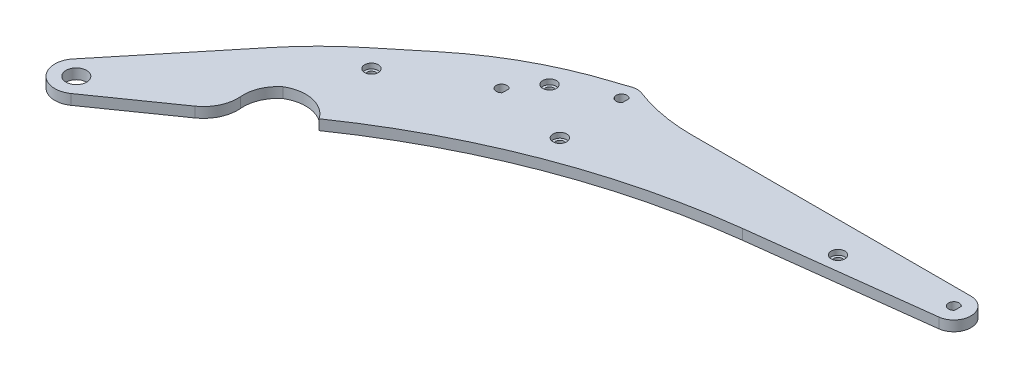
ISO-10303-21;
HEADER;
FILE_DESCRIPTION(('STEP AP214'),'2;1');
FILE_NAME('part.step','',(''),(''),'','','');
FILE_SCHEMA(('AUTOMOTIVE_DESIGN { 1 0 10303 214 1 1 1 1 }'));
ENDSEC;
DATA;
#1=APPLICATION_CONTEXT('core data for automotive mechanical design processes');
#2=APPLICATION_PROTOCOL_DEFINITION('international standard','automotive_design',2000,#1);
#3=PRODUCT_CONTEXT('',#1,'mechanical');
#4=PRODUCT('Part','Part','',(#3));
#5=PRODUCT_RELATED_PRODUCT_CATEGORY('part','',(#4));
#6=PRODUCT_DEFINITION_FORMATION('','',#4);
#7=PRODUCT_DEFINITION_CONTEXT('part definition',#1,'design');
#8=PRODUCT_DEFINITION('design','',#6,#7);
#9=PRODUCT_DEFINITION_SHAPE('','',#8);
#10=(LENGTH_UNIT() NAMED_UNIT(*) SI_UNIT(.MILLI.,.METRE.));
#11=(NAMED_UNIT(*) PLANE_ANGLE_UNIT() SI_UNIT($,.RADIAN.));
#12=(NAMED_UNIT(*) SI_UNIT($,.STERADIAN.) SOLID_ANGLE_UNIT());
#13=UNCERTAINTY_MEASURE_WITH_UNIT(LENGTH_MEASURE(1.E-05),#10,'distance_accuracy_value','');
#14=(GEOMETRIC_REPRESENTATION_CONTEXT(3) GLOBAL_UNCERTAINTY_ASSIGNED_CONTEXT((#13)) GLOBAL_UNIT_ASSIGNED_CONTEXT((#10,
#11,#12)) REPRESENTATION_CONTEXT('',''));
#15=CARTESIAN_POINT('',(0.,0.,0.));
#16=DIRECTION('',(0.,0.,1.));
#17=DIRECTION('',(1.,0.,0.));
#18=AXIS2_PLACEMENT_3D('',#15,#16,#17);
#19=CARTESIAN_POINT('',(-45.,0.,30.));
#20=DIRECTION('',(0.,1.,0.));
#21=DIRECTION('',(0.,0.,1.));
#22=AXIS2_PLACEMENT_3D('',#19,#20,#21);
#23=CYLINDRICAL_SURFACE('',#22,1.25);
#24=CARTESIAN_POINT('',(-45.,0.,30.));
#25=DIRECTION('',(0.,1.,0.));
#26=DIRECTION('',(0.,0.,1.));
#27=AXIS2_PLACEMENT_3D('',#24,#25,#26);
#28=CIRCLE('',#27,1.25);
#29=CARTESIAN_POINT('',(-45.,0.,31.25));
#30=VERTEX_POINT('',#29);
#31=EDGE_CURVE('E361',#30,#30,#28,.T.);
#32=ORIENTED_EDGE('',*,*,#31,.F.);
#33=EDGE_LOOP('',(#32));
#34=FACE_BOUND('',#33,.T.);
#35=CARTESIAN_POINT('',(-45.,1.5,30.));
#36=DIRECTION('',(0.,1.,0.));
#37=DIRECTION('',(0.,0.,1.));
#38=AXIS2_PLACEMENT_3D('',#35,#36,#37);
#39=CIRCLE('',#38,1.25);
#40=CARTESIAN_POINT('',(-45.,1.5,31.25));
#41=VERTEX_POINT('',#40);
#42=EDGE_CURVE('E358',#41,#41,#39,.F.);
#43=ORIENTED_EDGE('',*,*,#42,.F.);
#44=EDGE_LOOP('',(#43));
#45=FACE_BOUND('',#44,.T.);
#46=ADVANCED_FACE('F54',(#34,#45),#23,.F.);
#47=CARTESIAN_POINT('',(-15.,0.,8.));
#48=DIRECTION('',(0.,1.,0.));
#49=DIRECTION('',(0.,0.,1.));
#50=AXIS2_PLACEMENT_3D('',#47,#48,#49);
#51=CYLINDRICAL_SURFACE('',#50,1.24999999999999);
#52=CARTESIAN_POINT('',(-15.,0.,8.));
#53=DIRECTION('',(0.,1.,0.));
#54=DIRECTION('',(0.,0.,1.));
#55=AXIS2_PLACEMENT_3D('',#52,#53,#54);
#56=CIRCLE('',#55,1.24999999999999);
#57=CARTESIAN_POINT('',(-15.,0.,9.24999999999999));
#58=VERTEX_POINT('',#57);
#59=EDGE_CURVE('E416',#58,#58,#56,.T.);
#60=ORIENTED_EDGE('',*,*,#59,.F.);
#61=EDGE_LOOP('',(#60));
#62=FACE_BOUND('',#61,.T.);
#63=CARTESIAN_POINT('',(-15.,1.5,8.));
#64=DIRECTION('',(0.,1.,0.));
#65=DIRECTION('',(0.,0.,1.));
#66=AXIS2_PLACEMENT_3D('',#63,#64,#65);
#67=CIRCLE('',#66,1.24999999999999);
#68=CARTESIAN_POINT('',(-15.,1.5,9.24999999999999));
#69=VERTEX_POINT('',#68);
#70=EDGE_CURVE('E355',#69,#69,#67,.F.);
#71=ORIENTED_EDGE('',*,*,#70,.F.);
#72=EDGE_LOOP('',(#71));
#73=FACE_BOUND('',#72,.T.);
#74=ADVANCED_FACE('F476',(#62,#73),#51,.F.);
#75=CARTESIAN_POINT('',(0.,0.,20.));
#76=DIRECTION('',(0.,1.,0.));
#77=DIRECTION('',(0.,0.,1.));
#78=AXIS2_PLACEMENT_3D('',#75,#76,#77);
#79=CYLINDRICAL_SURFACE('',#78,1.24999999999999);
#80=CARTESIAN_POINT('',(0.,0.,20.));
#81=DIRECTION('',(0.,1.,0.));
#82=DIRECTION('',(0.,0.,1.));
#83=AXIS2_PLACEMENT_3D('',#80,#81,#82);
#84=CIRCLE('',#83,1.24999999999999);
#85=CARTESIAN_POINT('',(0.,0.,21.25));
#86=VERTEX_POINT('',#85);
#87=EDGE_CURVE('E419',#86,#86,#84,.T.);
#88=ORIENTED_EDGE('',*,*,#87,.F.);
#89=EDGE_LOOP('',(#88));
#90=FACE_BOUND('',#89,.T.);
#91=CARTESIAN_POINT('',(0.,1.5,20.));
#92=DIRECTION('',(0.,1.,0.));
#93=DIRECTION('',(0.,0.,1.));
#94=AXIS2_PLACEMENT_3D('',#91,#92,#93);
#95=CIRCLE('',#94,1.24999999999999);
#96=CARTESIAN_POINT('',(0.,1.5,21.25));
#97=VERTEX_POINT('',#96);
#98=EDGE_CURVE('E351',#97,#97,#95,.F.);
#99=ORIENTED_EDGE('',*,*,#98,.F.);
#100=EDGE_LOOP('',(#99));
#101=FACE_BOUND('',#100,.T.);
#102=ADVANCED_FACE('F482',(#90,#101),#79,.F.);
#103=CARTESIAN_POINT('',(70.2,0.,9.));
#104=DIRECTION('',(0.,1.,0.));
#105=DIRECTION('',(0.,0.,1.));
#106=AXIS2_PLACEMENT_3D('',#103,#104,#105);
#107=CYLINDRICAL_SURFACE('',#106,1.25);
#108=CARTESIAN_POINT('',(70.2,0.,9.));
#109=DIRECTION('',(0.,1.,0.));
#110=DIRECTION('',(0.,0.,1.));
#111=AXIS2_PLACEMENT_3D('',#108,#109,#110);
#112=CIRCLE('',#111,1.25);
#113=CARTESIAN_POINT('',(70.2,0.,10.25));
#114=VERTEX_POINT('',#113);
#115=EDGE_CURVE('E267',#114,#114,#112,.T.);
#116=ORIENTED_EDGE('',*,*,#115,.F.);
#117=EDGE_LOOP('',(#116));
#118=FACE_BOUND('',#117,.T.);
#119=CARTESIAN_POINT('',(70.2,1.5,9.));
#120=DIRECTION('',(0.,1.,0.));
#121=DIRECTION('',(0.,0.,1.));
#122=AXIS2_PLACEMENT_3D('',#119,#120,#121);
#123=CIRCLE('',#122,1.25);
#124=CARTESIAN_POINT('',(70.2,1.5,10.25));
#125=VERTEX_POINT('',#124);
#126=EDGE_CURVE('E348',#125,#125,#123,.F.);
#127=ORIENTED_EDGE('',*,*,#126,.F.);
#128=EDGE_LOOP('',(#127));
#129=FACE_BOUND('',#128,.T.);
#130=ADVANCED_FACE('F507',(#118,#129),#107,.F.);
#131=CARTESIAN_POINT('',(100.,3.,5.));
#132=DIRECTION('',(0.,-1.,0.));
#133=DIRECTION('',(0.,0.,-1.));
#134=AXIS2_PLACEMENT_3D('',#131,#132,#133);
#135=CYLINDRICAL_SURFACE('',#134,1.54999999999999);
#136=CARTESIAN_POINT('',(100.,0.,5.));
#137=DIRECTION('',(0.,1.,0.));
#138=DIRECTION('',(0.,0.,1.));
#139=AXIS2_PLACEMENT_3D('',#136,#137,#138);
#140=CIRCLE('',#139,1.54999999999999);
#141=CARTESIAN_POINT('',(101.2,0.,4.01892915648256));
#142=VERTEX_POINT('',#141);
#143=CARTESIAN_POINT('',(101.2,0.,5.98107084351744));
#144=VERTEX_POINT('',#143);
#145=EDGE_CURVE('E296',#142,#144,#140,.T.);
#146=ORIENTED_EDGE('',*,*,#145,.F.);
#147=DIRECTION('',(0.,-1.,0.));
#148=VECTOR('',#147,1.);
#149=CARTESIAN_POINT('',(101.2,3.,4.01892915648256));
#150=LINE('',#149,#148);
#151=CARTESIAN_POINT('',(101.2,3.,4.01892915648256));
#152=VERTEX_POINT('',#151);
#153=EDGE_CURVE('E307',#152,#142,#150,.T.);
#154=ORIENTED_EDGE('',*,*,#153,.F.);
#155=CARTESIAN_POINT('',(100.,3.,5.));
#156=DIRECTION('',(0.,1.,0.));
#157=DIRECTION('',(0.,0.,1.));
#158=AXIS2_PLACEMENT_3D('',#155,#156,#157);
#159=CIRCLE('',#158,1.54999999999999);
#160=CARTESIAN_POINT('',(101.2,3.,5.98107084351744));
#161=VERTEX_POINT('',#160);
#162=EDGE_CURVE('E254',#152,#161,#159,.T.);
#163=ORIENTED_EDGE('',*,*,#162,.T.);
#164=DIRECTION('',(0.,-1.,0.));
#165=VECTOR('',#164,1.);
#166=CARTESIAN_POINT('',(101.2,3.,5.98107084351744));
#167=LINE('',#166,#165);
#168=EDGE_CURVE('E305',#161,#144,#167,.T.);
#169=ORIENTED_EDGE('',*,*,#168,.T.);
#170=EDGE_LOOP('',(#146,#154,#163,#169));
#171=FACE_BOUND('',#170,.T.);
#172=ADVANCED_FACE('F503',(#171),#135,.F.);
#173=CARTESIAN_POINT('',(-1.,3.,1.));
#174=DIRECTION('',(0.,-1.,0.));
#175=DIRECTION('',(0.,0.,-1.));
#176=AXIS2_PLACEMENT_3D('',#173,#174,#175);
#177=CYLINDRICAL_SURFACE('',#176,1.55);
#178=CARTESIAN_POINT('',(-1.,0.,1.));
#179=DIRECTION('',(0.,1.,0.));
#180=DIRECTION('',(0.,0.,1.));
#181=AXIS2_PLACEMENT_3D('',#178,#179,#180);
#182=CIRCLE('',#181,1.55);
#183=CARTESIAN_POINT('',(0.2,0.,0.0189291564825707));
#184=VERTEX_POINT('',#183);
#185=CARTESIAN_POINT('',(0.2,0.,1.98107084351743));
#186=VERTEX_POINT('',#185);
#187=EDGE_CURVE('E290',#184,#186,#182,.T.);
#188=ORIENTED_EDGE('',*,*,#187,.F.);
#189=DIRECTION('',(0.,-1.,0.));
#190=VECTOR('',#189,1.);
#191=CARTESIAN_POINT('',(0.2,3.,0.0189291564825707));
#192=LINE('',#191,#190);
#193=CARTESIAN_POINT('',(0.2,3.,0.0189291564825707));
#194=VERTEX_POINT('',#193);
#195=EDGE_CURVE('E308',#194,#184,#192,.T.);
#196=ORIENTED_EDGE('',*,*,#195,.F.);
#197=CARTESIAN_POINT('',(-1.,3.,1.));
#198=DIRECTION('',(0.,1.,0.));
#199=DIRECTION('',(0.,0.,1.));
#200=AXIS2_PLACEMENT_3D('',#197,#198,#199);
#201=CIRCLE('',#200,1.55);
#202=CARTESIAN_POINT('',(0.2,3.,1.98107084351743));
#203=VERTEX_POINT('',#202);
#204=EDGE_CURVE('E249',#194,#203,#201,.T.);
#205=ORIENTED_EDGE('',*,*,#204,.T.);
#206=DIRECTION('',(0.,-1.,0.));
#207=VECTOR('',#206,1.);
#208=CARTESIAN_POINT('',(0.2,3.,1.98107084351743));
#209=LINE('',#208,#207);
#210=EDGE_CURVE('E311',#203,#186,#209,.T.);
#211=ORIENTED_EDGE('',*,*,#210,.T.);
#212=EDGE_LOOP('',(#188,#196,#205,#211));
#213=FACE_BOUND('',#212,.T.);
#214=ADVANCED_FACE('F506',(#213),#177,.F.);
#215=CARTESIAN_POINT('',(-21.,3.,16.));
#216=DIRECTION('',(0.,-1.,0.));
#217=DIRECTION('',(0.,0.,-1.));
#218=AXIS2_PLACEMENT_3D('',#215,#216,#217);
#219=CYLINDRICAL_SURFACE('',#218,1.55);
#220=CARTESIAN_POINT('',(-21.,0.,16.));
#221=DIRECTION('',(0.,1.,0.));
#222=DIRECTION('',(0.,0.,1.));
#223=AXIS2_PLACEMENT_3D('',#220,#221,#222);
#224=CIRCLE('',#223,1.55);
#225=CARTESIAN_POINT('',(-19.8,0.,15.0189291564826));
#226=VERTEX_POINT('',#225);
#227=CARTESIAN_POINT('',(-19.8,0.,16.9810708435174));
#228=VERTEX_POINT('',#227);
#229=EDGE_CURVE('E284',#226,#228,#224,.T.);
#230=ORIENTED_EDGE('',*,*,#229,.F.);
#231=DIRECTION('',(0.,-1.,0.));
#232=VECTOR('',#231,1.);
#233=CARTESIAN_POINT('',(-19.8,3.,15.0189291564826));
#234=LINE('',#233,#232);
#235=CARTESIAN_POINT('',(-19.8,3.,15.0189291564826));
#236=VERTEX_POINT('',#235);
#237=EDGE_CURVE('E313',#236,#226,#234,.T.);
#238=ORIENTED_EDGE('',*,*,#237,.F.);
#239=CARTESIAN_POINT('',(-21.,3.,16.));
#240=DIRECTION('',(0.,1.,0.));
#241=DIRECTION('',(0.,0.,1.));
#242=AXIS2_PLACEMENT_3D('',#239,#240,#241);
#243=CIRCLE('',#242,1.55);
#244=CARTESIAN_POINT('',(-19.8,3.,16.9810708435174));
#245=VERTEX_POINT('',#244);
#246=EDGE_CURVE('E244',#236,#245,#243,.T.);
#247=ORIENTED_EDGE('',*,*,#246,.T.);
#248=DIRECTION('',(0.,-1.,0.));
#249=VECTOR('',#248,1.);
#250=CARTESIAN_POINT('',(-19.8,3.,16.9810708435174));
#251=LINE('',#250,#249);
#252=EDGE_CURVE('E215',#245,#228,#251,.T.);
#253=ORIENTED_EDGE('',*,*,#252,.T.);
#254=EDGE_LOOP('',(#230,#238,#247,#253));
#255=FACE_BOUND('',#254,.T.);
#256=ADVANCED_FACE('F515',(#255),#219,.F.);
#257=CARTESIAN_POINT('',(-1.,3.,1.));
#258=DIRECTION('',(0.,-1.,0.));
#259=DIRECTION('',(0.,0.,-1.));
#260=AXIS2_PLACEMENT_3D('',#257,#258,#259);
#261=CYLINDRICAL_SURFACE('',#260,4.55);
#262=CARTESIAN_POINT('',(-1.,3.,1.));
#263=DIRECTION('',(0.,1.,0.));
#264=DIRECTION('',(0.,0.,1.));
#265=AXIS2_PLACEMENT_3D('',#262,#263,#264);
#266=CIRCLE('',#265,4.55);
#267=CARTESIAN_POINT('',(0.614581370200103,3.,-3.25389550870761));
#268=VERTEX_POINT('',#267);
#269=CARTESIAN_POINT('',(-2.6148671967167,3.,-3.25378701123697));
#270=VERTEX_POINT('',#269);
#271=EDGE_CURVE('E231',#268,#270,#266,.T.);
#272=ORIENTED_EDGE('',*,*,#271,.F.);
#273=DIRECTION('',(0.,-1.,0.));
#274=VECTOR('',#273,1.);
#275=CARTESIAN_POINT('',(0.614581370200102,3.,-3.25389550870761));
#276=LINE('',#275,#274);
#277=CARTESIAN_POINT('',(0.614581370200103,0.,-3.25389550870761));
#278=VERTEX_POINT('',#277);
#279=EDGE_CURVE('E334',#268,#278,#276,.T.);
#280=ORIENTED_EDGE('',*,*,#279,.T.);
#281=CARTESIAN_POINT('',(-1.,0.,1.));
#282=DIRECTION('',(0.,1.,0.));
#283=DIRECTION('',(0.,0.,1.));
#284=AXIS2_PLACEMENT_3D('',#281,#282,#283);
#285=CIRCLE('',#284,4.55);
#286=CARTESIAN_POINT('',(-2.6148671967167,0.,-3.25378701123697));
#287=VERTEX_POINT('',#286);
#288=EDGE_CURVE('E263',#278,#287,#285,.T.);
#289=ORIENTED_EDGE('',*,*,#288,.T.);
#290=DIRECTION('',(0.,-1.,0.));
#291=VECTOR('',#290,1.);
#292=CARTESIAN_POINT('',(-2.6148671967167,3.,-3.25378701123697));
#293=LINE('',#292,#291);
#294=EDGE_CURVE('E332',#287,#270,#293,.F.);
#295=ORIENTED_EDGE('',*,*,#294,.T.);
#296=EDGE_LOOP('',(#272,#280,#289,#295));
#297=FACE_BOUND('',#296,.T.);
#298=ADVANCED_FACE('F409',(#297),#261,.T.);
#299=CARTESIAN_POINT('',(-8.01607595177476,3.,-9.80122672785777));
#300=DIRECTION('',(-0.633090670906418,0.,-0.774077646241811));
#301=DIRECTION('',(-0.774077646241811,0.,0.633090670906418));
#302=AXIS2_PLACEMENT_3D('',#299,#300,#301);
#303=PLANE('',#302);
#304=DIRECTION('',(0.774077646241811,0.,-0.633090670906418));
#305=VECTOR('',#304,1.);
#306=CARTESIAN_POINT('',(-8.01607595177476,3.,-9.80122672785777));
#307=LINE('',#306,#305);
#308=CARTESIAN_POINT('',(-51.0674920273638,3.,25.409000591188));
#309=VERTEX_POINT('',#308);
#310=CARTESIAN_POINT('',(-39.4892560844115,3.,15.9395717856613));
#311=VERTEX_POINT('',#310);
#312=EDGE_CURVE('E228',#309,#311,#307,.T.);
#313=ORIENTED_EDGE('',*,*,#312,.T.);
#314=DIRECTION('',(0.,-1.,0.));
#315=VECTOR('',#314,1.);
#316=CARTESIAN_POINT('',(-39.4892560844115,0.,15.9395717856613));
#317=LINE('',#316,#315);
#318=CARTESIAN_POINT('',(-39.4892560844115,0.,15.9395717856613));
#319=VERTEX_POINT('',#318);
#320=EDGE_CURVE('E384',#311,#319,#317,.T.);
#321=ORIENTED_EDGE('',*,*,#320,.T.);
#322=DIRECTION('',(0.774077646241811,0.,-0.633090670906418));
#323=VECTOR('',#322,1.);
#324=CARTESIAN_POINT('',(-8.01607595177476,0.,-9.80122672785777));
#325=LINE('',#324,#323);
#326=CARTESIAN_POINT('',(-51.0674920273638,0.,25.409000591188));
#327=VERTEX_POINT('',#326);
#328=EDGE_CURVE('E266',#327,#319,#325,.T.);
#329=ORIENTED_EDGE('',*,*,#328,.F.);
#330=DIRECTION('',(0.,-1.,0.));
#331=VECTOR('',#330,1.);
#332=CARTESIAN_POINT('',(-51.0674920273638,3.,25.409000591188));
#333=LINE('',#332,#331);
#334=EDGE_CURVE('E378',#327,#309,#333,.F.);
#335=ORIENTED_EDGE('',*,*,#334,.T.);
#336=EDGE_LOOP('',(#313,#321,#329,#335));
#337=FACE_BOUND('',#336,.T.);
#338=ADVANCED_FACE('F397',(#337),#303,.T.);
#339=CARTESIAN_POINT('',(-19.6861379696952,3.,-16.1005945014684));
#340=DIRECTION('',(-0.774077646241813,0.,-0.633090670906415));
#341=DIRECTION('',(-0.633090670906415,0.,0.774077646241813));
#342=AXIS2_PLACEMENT_3D('',#339,#340,#341);
#343=PLANE('',#342);
#344=DIRECTION('',(0.633090670906415,0.,-0.774077646241813));
#345=VECTOR('',#344,1.);
#346=CARTESIAN_POINT('',(-19.6861379696952,3.,-16.1005945014684));
#347=LINE('',#346,#345);
#348=CARTESIAN_POINT('',(-90.575190152091,3.,70.5751901520913));
#349=VERTEX_POINT('',#348);
#350=CARTESIAN_POINT('',(-65.1661895609034,3.,39.5076981247276));
#351=VERTEX_POINT('',#350);
#352=EDGE_CURVE('E209',#349,#351,#347,.T.);
#353=ORIENTED_EDGE('',*,*,#352,.T.);
#354=DIRECTION('',(0.,-1.,0.));
#355=VECTOR('',#354,1.);
#356=CARTESIAN_POINT('',(-65.1661895609033,3.,39.5076981247275));
#357=LINE('',#356,#355);
#358=CARTESIAN_POINT('',(-65.1661895609034,0.,39.5076981247276));
#359=VERTEX_POINT('',#358);
#360=EDGE_CURVE('E14',#351,#359,#357,.T.);
#361=ORIENTED_EDGE('',*,*,#360,.T.);
#362=DIRECTION('',(0.633090670906415,0.,-0.774077646241813));
#363=VECTOR('',#362,1.);
#364=CARTESIAN_POINT('',(-19.6861379696952,0.,-16.1005945014684));
#365=LINE('',#364,#363);
#366=CARTESIAN_POINT('',(-90.575190152091,0.,70.5751901520913));
#367=VERTEX_POINT('',#366);
#368=EDGE_CURVE('E212',#367,#359,#365,.T.);
#369=ORIENTED_EDGE('',*,*,#368,.F.);
#370=DIRECTION('',(0.,-1.,0.));
#371=VECTOR('',#370,1.);
#372=CARTESIAN_POINT('',(-90.575190152091,3.,70.5751901520913));
#373=LINE('',#372,#371);
#374=EDGE_CURVE('E206',#349,#367,#373,.T.);
#375=ORIENTED_EDGE('',*,*,#374,.F.);
#376=EDGE_LOOP('',(#353,#361,#369,#375));
#377=FACE_BOUND('',#376,.T.);
#378=ADVANCED_FACE('F208',(#377),#343,.T.);
#379=CARTESIAN_POINT('',(-86.1503803041823,3.,75.));
#380=DIRECTION('',(0.,-1.,0.));
#381=DIRECTION('',(0.,0.,-1.));
#382=AXIS2_PLACEMENT_3D('',#379,#380,#381);
#383=CYLINDRICAL_SURFACE('',#382,6.25762609783452);
#384=CARTESIAN_POINT('',(-86.1503803041823,0.,75.));
#385=DIRECTION('',(0.,1.,0.));
#386=DIRECTION('',(0.,0.,1.));
#387=AXIS2_PLACEMENT_3D('',#384,#385,#386);
#388=CIRCLE('',#387,6.25762609783452);
#389=CARTESIAN_POINT('',(-82.561153426969,0.,80.1259472104373));
#390=VERTEX_POINT('',#389);
#391=EDGE_CURVE('E271',#367,#390,#388,.T.);
#392=ORIENTED_EDGE('',*,*,#391,.T.);
#393=DIRECTION('',(0.,-1.,0.));
#394=VECTOR('',#393,1.);
#395=CARTESIAN_POINT('',(-82.561153426969,3.,80.1259472104373));
#396=LINE('',#395,#394);
#397=CARTESIAN_POINT('',(-82.561153426969,3.,80.1259472104373));
#398=VERTEX_POINT('',#397);
#399=EDGE_CURVE('E216',#398,#390,#396,.T.);
#400=ORIENTED_EDGE('',*,*,#399,.F.);
#401=CARTESIAN_POINT('',(-86.1503803041823,3.,75.));
#402=DIRECTION('',(0.,1.,0.));
#403=DIRECTION('',(0.,0.,1.));
#404=AXIS2_PLACEMENT_3D('',#401,#402,#403);
#405=CIRCLE('',#404,6.25762609783452);
#406=EDGE_CURVE('E219',#349,#398,#405,.T.);
#407=ORIENTED_EDGE('',*,*,#406,.F.);
#408=ORIENTED_EDGE('',*,*,#374,.T.);
#409=EDGE_LOOP('',(#392,#400,#407,#408));
#410=FACE_BOUND('',#409,.T.);
#411=ADVANCED_FACE('F220',(#410),#383,.T.);
#412=CARTESIAN_POINT('',(10.4850927141918,3.,14.9742642602791));
#413=DIRECTION('',(-0.573576436351053,0.,-0.819152044288987));
#414=DIRECTION('',(-0.819152044288987,0.,0.573576436351054));
#415=AXIS2_PLACEMENT_3D('',#412,#413,#414);
#416=PLANE('',#415);
#417=DIRECTION('',(0.819152044288987,0.,-0.573576436351054));
#418=VECTOR('',#417,1.);
#419=CARTESIAN_POINT('',(10.4850927141918,0.,14.9742642602791));
#420=LINE('',#419,#418);
#421=CARTESIAN_POINT('',(-61.2632002754554,0.,65.2129598653099));
#422=VERTEX_POINT('',#421);
#423=EDGE_CURVE('E273',#390,#422,#420,.T.);
#424=ORIENTED_EDGE('',*,*,#423,.T.);
#425=DIRECTION('',(0.,-1.,0.));
#426=VECTOR('',#425,1.);
#427=CARTESIAN_POINT('',(-61.2632002754554,3.,65.2129598653099));
#428=LINE('',#427,#426);
#429=CARTESIAN_POINT('',(-61.2632002754554,3.,65.2129598653099));
#430=VERTEX_POINT('',#429);
#431=EDGE_CURVE('E363',#422,#430,#428,.F.);
#432=ORIENTED_EDGE('',*,*,#431,.T.);
#433=DIRECTION('',(0.819152044288987,0.,-0.573576436351054));
#434=VECTOR('',#433,1.);
#435=CARTESIAN_POINT('',(10.4850927141918,3.,14.9742642602791));
#436=LINE('',#435,#434);
#437=EDGE_CURVE('E224',#398,#430,#436,.T.);
#438=ORIENTED_EDGE('',*,*,#437,.F.);
#439=ORIENTED_EDGE('',*,*,#399,.T.);
#440=EDGE_LOOP('',(#424,#432,#438,#439));
#441=FACE_BOUND('',#440,.T.);
#442=ADVANCED_FACE('F532',(#441),#416,.F.);
#443=CARTESIAN_POINT('',(2.69936514222486,3.,21.9845648538794));
#444=DIRECTION('',(0.121869343405141,0.,0.992546151641323));
#445=DIRECTION('',(0.992546151641323,0.,-0.121869343405141));
#446=AXIS2_PLACEMENT_3D('',#443,#444,#445);
#447=PLANE('',#446);
#448=DIRECTION('',(-0.992546151641323,0.,0.121869343405141));
#449=VECTOR('',#448,1.);
#450=CARTESIAN_POINT('',(2.69936514222486,3.,21.9845648538794));
#451=LINE('',#450,#449);
#452=CARTESIAN_POINT('',(100.609346717026,3.,9.96273075820661));
#453=VERTEX_POINT('',#452);
#454=CARTESIAN_POINT('',(49.4877157803174,3.,16.2396777654103));
#455=VERTEX_POINT('',#454);
#456=EDGE_CURVE('E236',#453,#455,#451,.T.);
#457=ORIENTED_EDGE('',*,*,#456,.T.);
#458=DIRECTION('',(0.,1.,0.));
#459=VECTOR('',#458,1.);
#460=CARTESIAN_POINT('',(49.4877157803174,0.,16.2396777654103));
#461=LINE('',#460,#459);
#462=CARTESIAN_POINT('',(49.4877157803174,0.,16.2396777654103));
#463=VERTEX_POINT('',#462);
#464=EDGE_CURVE('E310',#455,#463,#461,.F.);
#465=ORIENTED_EDGE('',*,*,#464,.T.);
#466=DIRECTION('',(-0.992546151641323,0.,0.121869343405141));
#467=VECTOR('',#466,1.);
#468=CARTESIAN_POINT('',(2.69936514222486,0.,21.9845648538794));
#469=LINE('',#468,#467);
#470=CARTESIAN_POINT('',(100.609346717026,0.,9.96273075820661));
#471=VERTEX_POINT('',#470);
#472=EDGE_CURVE('E276',#471,#463,#469,.T.);
#473=ORIENTED_EDGE('',*,*,#472,.F.);
#474=DIRECTION('',(0.,-1.,0.));
#475=VECTOR('',#474,1.);
#476=CARTESIAN_POINT('',(100.609346717026,3.,9.96273075820661));
#477=LINE('',#476,#475);
#478=EDGE_CURVE('E319',#453,#471,#477,.T.);
#479=ORIENTED_EDGE('',*,*,#478,.F.);
#480=EDGE_LOOP('',(#457,#465,#473,#479));
#481=FACE_BOUND('',#480,.T.);
#482=ADVANCED_FACE('F528',(#481),#447,.T.);
#483=CARTESIAN_POINT('',(100.,3.,5.));
#484=DIRECTION('',(0.,-1.,0.));
#485=DIRECTION('',(0.,0.,-1.));
#486=AXIS2_PLACEMENT_3D('',#483,#484,#485);
#487=CYLINDRICAL_SURFACE('',#486,5.);
#488=CARTESIAN_POINT('',(100.,0.,5.));
#489=DIRECTION('',(0.,1.,0.));
#490=DIRECTION('',(0.,0.,1.));
#491=AXIS2_PLACEMENT_3D('',#488,#489,#490);
#492=CIRCLE('',#491,5.);
#493=CARTESIAN_POINT('',(100.,0.,0.));
#494=VERTEX_POINT('',#493);
#495=EDGE_CURVE('E279',#471,#494,#492,.T.);
#496=ORIENTED_EDGE('',*,*,#495,.T.);
#497=DIRECTION('',(0.,-1.,0.));
#498=VECTOR('',#497,1.);
#499=CARTESIAN_POINT('',(100.,3.,0.));
#500=LINE('',#499,#498);
#501=CARTESIAN_POINT('',(100.,3.,0.));
#502=VERTEX_POINT('',#501);
#503=EDGE_CURVE('E262',#502,#494,#500,.T.);
#504=ORIENTED_EDGE('',*,*,#503,.F.);
#505=CARTESIAN_POINT('',(100.,3.,5.));
#506=DIRECTION('',(0.,1.,0.));
#507=DIRECTION('',(0.,0.,1.));
#508=AXIS2_PLACEMENT_3D('',#505,#506,#507);
#509=CIRCLE('',#508,5.);
#510=EDGE_CURVE('E239',#453,#502,#509,.T.);
#511=ORIENTED_EDGE('',*,*,#510,.F.);
#512=ORIENTED_EDGE('',*,*,#478,.T.);
#513=EDGE_LOOP('',(#496,#504,#511,#512));
#514=FACE_BOUND('',#513,.T.);
#515=ADVANCED_FACE('F501',(#514),#487,.T.);
#516=CARTESIAN_POINT('',(101.2,3.,0.));
#517=DIRECTION('',(1.,0.,0.));
#518=DIRECTION('',(0.,0.,-1.));
#519=AXIS2_PLACEMENT_3D('',#516,#517,#518);
#520=PLANE('',#519);
#521=DIRECTION('',(0.,0.,1.));
#522=VECTOR('',#521,1.);
#523=CARTESIAN_POINT('',(101.2,0.,0.));
#524=LINE('',#523,#522);
#525=EDGE_CURVE('E299',#142,#144,#524,.T.);
#526=ORIENTED_EDGE('',*,*,#525,.T.);
#527=ORIENTED_EDGE('',*,*,#168,.F.);
#528=DIRECTION('',(0.,0.,1.));
#529=VECTOR('',#528,1.);
#530=CARTESIAN_POINT('',(101.2,3.,0.));
#531=LINE('',#530,#529);
#532=EDGE_CURVE('E257',#152,#161,#531,.T.);
#533=ORIENTED_EDGE('',*,*,#532,.F.);
#534=ORIENTED_EDGE('',*,*,#153,.T.);
#535=EDGE_LOOP('',(#526,#527,#533,#534));
#536=FACE_BOUND('',#535,.T.);
#537=ADVANCED_FACE('F497',(#536),#520,.F.);
#538=CARTESIAN_POINT('',(0.2,3.,0.));
#539=DIRECTION('',(1.,0.,0.));
#540=DIRECTION('',(0.,0.,-1.));
#541=AXIS2_PLACEMENT_3D('',#538,#539,#540);
#542=PLANE('',#541);
#543=DIRECTION('',(0.,0.,1.));
#544=VECTOR('',#543,1.);
#545=CARTESIAN_POINT('',(0.2,0.,0.));
#546=LINE('',#545,#544);
#547=EDGE_CURVE('E293',#184,#186,#546,.T.);
#548=ORIENTED_EDGE('',*,*,#547,.T.);
#549=ORIENTED_EDGE('',*,*,#210,.F.);
#550=DIRECTION('',(0.,0.,1.));
#551=VECTOR('',#550,1.);
#552=CARTESIAN_POINT('',(0.2,3.,0.));
#553=LINE('',#552,#551);
#554=EDGE_CURVE('E252',#194,#203,#553,.T.);
#555=ORIENTED_EDGE('',*,*,#554,.F.);
#556=ORIENTED_EDGE('',*,*,#195,.T.);
#557=EDGE_LOOP('',(#548,#549,#555,#556));
#558=FACE_BOUND('',#557,.T.);
#559=ADVANCED_FACE('F500',(#558),#542,.F.);
#560=CARTESIAN_POINT('',(-19.8,3.,0.));
#561=DIRECTION('',(1.,0.,0.));
#562=DIRECTION('',(0.,0.,-1.));
#563=AXIS2_PLACEMENT_3D('',#560,#561,#562);
#564=PLANE('',#563);
#565=DIRECTION('',(0.,0.,1.));
#566=VECTOR('',#565,1.);
#567=CARTESIAN_POINT('',(-19.8,0.,0.));
#568=LINE('',#567,#566);
#569=EDGE_CURVE('E287',#226,#228,#568,.T.);
#570=ORIENTED_EDGE('',*,*,#569,.T.);
#571=ORIENTED_EDGE('',*,*,#252,.F.);
#572=DIRECTION('',(0.,0.,1.));
#573=VECTOR('',#572,1.);
#574=CARTESIAN_POINT('',(-19.8,3.,0.));
#575=LINE('',#574,#573);
#576=EDGE_CURVE('E247',#236,#245,#575,.T.);
#577=ORIENTED_EDGE('',*,*,#576,.F.);
#578=ORIENTED_EDGE('',*,*,#237,.T.);
#579=EDGE_LOOP('',(#570,#571,#577,#578));
#580=FACE_BOUND('',#579,.T.);
#581=ADVANCED_FACE('F511',(#580),#564,.F.);
#582=CARTESIAN_POINT('',(0.,3.,0.));
#583=DIRECTION('',(0.,0.,-1.));
#584=DIRECTION('',(-1.,0.,0.));
#585=AXIS2_PLACEMENT_3D('',#582,#583,#584);
#586=PLANE('',#585);
#587=DIRECTION('',(1.,0.,0.));
#588=VECTOR('',#587,1.);
#589=CARTESIAN_POINT('',(0.,0.,0.));
#590=LINE('',#589,#588);
#591=CARTESIAN_POINT('',(18.3572337899814,0.,0.));
#592=VERTEX_POINT('',#591);
#593=EDGE_CURVE('E282',#592,#494,#590,.T.);
#594=ORIENTED_EDGE('',*,*,#593,.F.);
#595=DIRECTION('',(0.,-1.,0.));
#596=VECTOR('',#595,1.);
#597=CARTESIAN_POINT('',(18.3572337899814,3.,0.));
#598=LINE('',#597,#596);
#599=CARTESIAN_POINT('',(18.3572337899814,3.,0.));
#600=VERTEX_POINT('',#599);
#601=EDGE_CURVE('E337',#592,#600,#598,.F.);
#602=ORIENTED_EDGE('',*,*,#601,.T.);
#603=DIRECTION('',(1.,0.,0.));
#604=VECTOR('',#603,1.);
#605=CARTESIAN_POINT('',(0.,3.,0.));
#606=LINE('',#605,#604);
#607=EDGE_CURVE('E242',#600,#502,#606,.T.);
#608=ORIENTED_EDGE('',*,*,#607,.T.);
#609=ORIENTED_EDGE('',*,*,#503,.T.);
#610=EDGE_LOOP('',(#594,#602,#608,#609));
#611=FACE_BOUND('',#610,.T.);
#612=ADVANCED_FACE('F495',(#611),#586,.T.);
#613=CARTESIAN_POINT('',(-86.1503803041823,3.,75.));
#614=DIRECTION('',(0.,-1.,0.));
#615=DIRECTION('',(0.,0.,-1.));
#616=AXIS2_PLACEMENT_3D('',#613,#614,#615);
#617=CYLINDRICAL_SURFACE('',#616,3.00000000000001);
#618=CARTESIAN_POINT('',(-86.1503803041823,3.,75.));
#619=DIRECTION('',(0.,1.,0.));
#620=DIRECTION('',(0.,0.,1.));
#621=AXIS2_PLACEMENT_3D('',#618,#619,#620);
#622=CIRCLE('',#621,3.00000000000001);
#623=CARTESIAN_POINT('',(-86.1503803041823,3.,78.));
#624=VERTEX_POINT('',#623);
#625=EDGE_CURVE('E259',#624,#624,#622,.T.);
#626=ORIENTED_EDGE('',*,*,#625,.T.);
#627=EDGE_LOOP('',(#626));
#628=FACE_BOUND('',#627,.T.);
#629=CARTESIAN_POINT('',(-86.1503803041823,0.,75.));
#630=DIRECTION('',(0.,1.,0.));
#631=DIRECTION('',(0.,0.,1.));
#632=AXIS2_PLACEMENT_3D('',#629,#630,#631);
#633=CIRCLE('',#632,3.00000000000001);
#634=CARTESIAN_POINT('',(-86.1503803041823,0.,78.));
#635=VERTEX_POINT('',#634);
#636=EDGE_CURVE('E302',#635,#635,#633,.T.);
#637=ORIENTED_EDGE('',*,*,#636,.F.);
#638=EDGE_LOOP('',(#637));
#639=FACE_BOUND('',#638,.T.);
#640=ADVANCED_FACE('F451',(#628,#639),#617,.F.);
#641=CARTESIAN_POINT('',(0.,3.,0.));
#642=DIRECTION('',(0.,1.,0.));
#643=DIRECTION('',(0.,0.,1.));
#644=AXIS2_PLACEMENT_3D('',#641,#642,#643);
#645=PLANE('',#644);
#646=CARTESIAN_POINT('',(70.2,3.,9.));
#647=DIRECTION('',(0.,1.,0.));
#648=DIRECTION('',(0.,0.,1.));
#649=AXIS2_PLACEMENT_3D('',#646,#647,#648);
#650=CIRCLE('',#649,2.);
#651=CARTESIAN_POINT('',(70.2,3.,11.));
#652=VERTEX_POINT('',#651);
#653=EDGE_CURVE('E439',#652,#652,#650,.T.);
#654=ORIENTED_EDGE('',*,*,#653,.F.);
#655=EDGE_LOOP('',(#654));
#656=FACE_BOUND('',#655,.T.);
#657=CARTESIAN_POINT('',(0.,3.,20.));
#658=DIRECTION('',(0.,1.,0.));
#659=DIRECTION('',(0.,0.,1.));
#660=AXIS2_PLACEMENT_3D('',#657,#658,#659);
#661=CIRCLE('',#660,2.);
#662=CARTESIAN_POINT('',(0.,3.,22.));
#663=VERTEX_POINT('',#662);
#664=EDGE_CURVE('E436',#663,#663,#661,.T.);
#665=ORIENTED_EDGE('',*,*,#664,.F.);
#666=EDGE_LOOP('',(#665));
#667=FACE_BOUND('',#666,.T.);
#668=CARTESIAN_POINT('',(-45.,3.,30.));
#669=DIRECTION('',(0.,1.,0.));
#670=DIRECTION('',(0.,0.,1.));
#671=AXIS2_PLACEMENT_3D('',#668,#669,#670);
#672=CIRCLE('',#671,2.00000000000001);
#673=CARTESIAN_POINT('',(-45.,3.,32.));
#674=VERTEX_POINT('',#673);
#675=EDGE_CURVE('E430',#674,#674,#672,.T.);
#676=ORIENTED_EDGE('',*,*,#675,.F.);
#677=EDGE_LOOP('',(#676));
#678=FACE_BOUND('',#677,.T.);
#679=CARTESIAN_POINT('',(-15.,3.,8.));
#680=DIRECTION('',(0.,1.,0.));
#681=DIRECTION('',(0.,0.,1.));
#682=AXIS2_PLACEMENT_3D('',#679,#680,#681);
#683=CIRCLE('',#682,2.);
#684=CARTESIAN_POINT('',(-15.,3.,10.));
#685=VERTEX_POINT('',#684);
#686=EDGE_CURVE('E424',#685,#685,#683,.T.);
#687=ORIENTED_EDGE('',*,*,#686,.F.);
#688=EDGE_LOOP('',(#687));
#689=FACE_BOUND('',#688,.T.);
#690=CARTESIAN_POINT('',(-20.3606605672299,3.,-49.9986992226322));
#691=DIRECTION('',(0.,1.,0.));
#692=DIRECTION('',(0.,0.,1.));
#693=AXIS2_PLACEMENT_3D('',#690,#691,#692);
#694=CIRCLE('',#693,50.);
#695=CARTESIAN_POINT('',(-5.63383670940984,3.,-2.2166873451407));
#696=VERTEX_POINT('',#695);
#697=EDGE_CURVE('E345',#270,#696,#694,.F.);
#698=ORIENTED_EDGE('',*,*,#697,.T.);
#699=CARTESIAN_POINT('',(23.8198110062302,3.,93.3473364098424));
#700=DIRECTION('',(0.,1.,0.));
#701=DIRECTION('',(0.,0.,1.));
#702=AXIS2_PLACEMENT_3D('',#699,#700,#701);
#703=CIRCLE('',#702,100.);
#704=EDGE_CURVE('E62',#696,#311,#703,.T.);
#705=ORIENTED_EDGE('',*,*,#704,.T.);
#706=ORIENTED_EDGE('',*,*,#312,.F.);
#707=CARTESIAN_POINT('',(12.241575063278,3.,102.816765215369));
#708=DIRECTION('',(0.,1.,0.));
#709=DIRECTION('',(0.,0.,1.));
#710=AXIS2_PLACEMENT_3D('',#707,#708,#709);
#711=CIRCLE('',#710,100.);
#712=EDGE_CURVE('E69',#309,#351,#711,.T.);
#713=ORIENTED_EDGE('',*,*,#712,.T.);
#714=ORIENTED_EDGE('',*,*,#352,.F.);
#715=ORIENTED_EDGE('',*,*,#406,.T.);
#716=ORIENTED_EDGE('',*,*,#437,.T.);
#717=CARTESIAN_POINT('',(-66.9989646389659,3.,57.02143942242));
#718=DIRECTION('',(0.,1.,0.));
#719=DIRECTION('',(0.,0.,1.));
#720=AXIS2_PLACEMENT_3D('',#717,#718,#719);
#721=CIRCLE('',#720,10.);
#722=CARTESIAN_POINT('',(-57.0370176580485,3.,56.1498819949433));
#723=VERTEX_POINT('',#722);
#724=EDGE_CURVE('E365',#430,#723,#721,.T.);
#725=ORIENTED_EDGE('',*,*,#724,.T.);
#726=CARTESIAN_POINT('',(-47.075070677131,3.,55.2783245674667));
#727=DIRECTION('',(0.,1.,0.));
#728=DIRECTION('',(0.,0.,1.));
#729=AXIS2_PLACEMENT_3D('',#726,#727,#728);
#730=CIRCLE('',#729,10.);
#731=CARTESIAN_POINT('',(-53.3391677169251,3.,47.4833846526216));
#732=VERTEX_POINT('',#731);
#733=EDGE_CURVE('E376',#723,#732,#730,.F.);
#734=ORIENTED_EDGE('',*,*,#733,.T.);
#735=CARTESIAN_POINT('',(-48.1567675668316,3.,56.035736883693));
#736=DIRECTION('',(0.,1.,0.));
#737=DIRECTION('',(0.,0.,1.));
#738=AXIS2_PLACEMENT_3D('',#735,#736,#737);
#739=CIRCLE('',#738,10.);
#740=CARTESIAN_POINT('',(-39.9652471239418,3.,50.2999725201825));
#741=VERTEX_POINT('',#740);
#742=EDGE_CURVE('E372',#732,#741,#739,.F.);
#743=ORIENTED_EDGE('',*,*,#742,.T.);
#744=CARTESIAN_POINT('',(73.8615844613456,3.,214.748908093675));
#745=DIRECTION('',(0.,1.,0.));
#746=DIRECTION('',(0.,0.,1.));
#747=AXIS2_PLACEMENT_3D('',#744,#745,#746);
#748=CIRCLE('',#747,200.);
#749=EDGE_CURVE('E330',#741,#455,#748,.F.);
#750=ORIENTED_EDGE('',*,*,#749,.T.);
#751=ORIENTED_EDGE('',*,*,#456,.F.);
#752=ORIENTED_EDGE('',*,*,#510,.T.);
#753=ORIENTED_EDGE('',*,*,#607,.F.);
#754=CARTESIAN_POINT('',(18.3572337899814,3.,-50.));
#755=DIRECTION('',(0.,1.,0.));
#756=DIRECTION('',(0.,0.,1.));
#757=AXIS2_PLACEMENT_3D('',#754,#755,#756);
#758=CIRCLE('',#757,50.);
#759=EDGE_CURVE('E341',#600,#268,#758,.F.);
#760=ORIENTED_EDGE('',*,*,#759,.T.);
#761=ORIENTED_EDGE('',*,*,#271,.T.);
#762=EDGE_LOOP('',(#698,#705,#706,#713,#714,#715,#716,#725,#734,#743,#750,#751,#752,#753,#760,#761));
#763=FACE_BOUND('',#762,.T.);
#764=ORIENTED_EDGE('',*,*,#246,.F.);
#765=ORIENTED_EDGE('',*,*,#576,.T.);
#766=EDGE_LOOP('',(#764,#765));
#767=FACE_BOUND('',#766,.T.);
#768=ORIENTED_EDGE('',*,*,#204,.F.);
#769=ORIENTED_EDGE('',*,*,#554,.T.);
#770=EDGE_LOOP('',(#768,#769));
#771=FACE_BOUND('',#770,.T.);
#772=ORIENTED_EDGE('',*,*,#162,.F.);
#773=ORIENTED_EDGE('',*,*,#532,.T.);
#774=EDGE_LOOP('',(#772,#773));
#775=FACE_BOUND('',#774,.T.);
#776=ORIENTED_EDGE('',*,*,#625,.F.);
#777=EDGE_LOOP('',(#776));
#778=FACE_BOUND('',#777,.T.);
#779=ADVANCED_FACE('F226',(#656,#667,#678,#689,#763,#767,#771,#775,#778),#645,.T.);
#780=CARTESIAN_POINT('',(0.,0.,0.));
#781=DIRECTION('',(0.,1.,0.));
#782=DIRECTION('',(0.,0.,1.));
#783=AXIS2_PLACEMENT_3D('',#780,#781,#782);
#784=PLANE('',#783);
#785=ORIENTED_EDGE('',*,*,#115,.T.);
#786=EDGE_LOOP('',(#785));
#787=FACE_BOUND('',#786,.T.);
#788=ORIENTED_EDGE('',*,*,#87,.T.);
#789=EDGE_LOOP('',(#788));
#790=FACE_BOUND('',#789,.T.);
#791=ORIENTED_EDGE('',*,*,#59,.T.);
#792=EDGE_LOOP('',(#791));
#793=FACE_BOUND('',#792,.T.);
#794=ORIENTED_EDGE('',*,*,#31,.T.);
#795=EDGE_LOOP('',(#794));
#796=FACE_BOUND('',#795,.T.);
#797=ORIENTED_EDGE('',*,*,#328,.T.);
#798=CARTESIAN_POINT('',(23.8198110062302,0.,93.3473364098424));
#799=DIRECTION('',(0.,1.,0.));
#800=DIRECTION('',(0.,0.,1.));
#801=AXIS2_PLACEMENT_3D('',#798,#799,#800);
#802=CIRCLE('',#801,100.);
#803=CARTESIAN_POINT('',(-5.63383670940984,0.,-2.2166873451407));
#804=VERTEX_POINT('',#803);
#805=EDGE_CURVE('E389',#319,#804,#802,.F.);
#806=ORIENTED_EDGE('',*,*,#805,.T.);
#807=CARTESIAN_POINT('',(-20.3606605672299,0.,-49.9986992226322));
#808=DIRECTION('',(0.,1.,0.));
#809=DIRECTION('',(0.,0.,1.));
#810=AXIS2_PLACEMENT_3D('',#807,#808,#809);
#811=CIRCLE('',#810,50.);
#812=EDGE_CURVE('E343',#804,#287,#811,.T.);
#813=ORIENTED_EDGE('',*,*,#812,.T.);
#814=ORIENTED_EDGE('',*,*,#288,.F.);
#815=CARTESIAN_POINT('',(18.3572337899814,0.,-50.));
#816=DIRECTION('',(0.,1.,0.));
#817=DIRECTION('',(0.,0.,1.));
#818=AXIS2_PLACEMENT_3D('',#815,#816,#817);
#819=CIRCLE('',#818,50.);
#820=EDGE_CURVE('E339',#278,#592,#819,.T.);
#821=ORIENTED_EDGE('',*,*,#820,.T.);
#822=ORIENTED_EDGE('',*,*,#593,.T.);
#823=ORIENTED_EDGE('',*,*,#495,.F.);
#824=ORIENTED_EDGE('',*,*,#472,.T.);
#825=CARTESIAN_POINT('',(73.8615844613456,0.,214.748908093675));
#826=DIRECTION('',(0.,1.,0.));
#827=DIRECTION('',(0.,0.,1.));
#828=AXIS2_PLACEMENT_3D('',#825,#826,#827);
#829=CIRCLE('',#828,200.);
#830=CARTESIAN_POINT('',(-39.9652471239418,0.,50.2999725201825));
#831=VERTEX_POINT('',#830);
#832=EDGE_CURVE('E327',#463,#831,#829,.T.);
#833=ORIENTED_EDGE('',*,*,#832,.T.);
#834=CARTESIAN_POINT('',(-48.1567675668316,0.,56.035736883693));
#835=DIRECTION('',(0.,1.,0.));
#836=DIRECTION('',(0.,0.,1.));
#837=AXIS2_PLACEMENT_3D('',#834,#835,#836);
#838=CIRCLE('',#837,10.);
#839=CARTESIAN_POINT('',(-53.3391677169251,0.,47.4833846526216));
#840=VERTEX_POINT('',#839);
#841=EDGE_CURVE('E370',#831,#840,#838,.T.);
#842=ORIENTED_EDGE('',*,*,#841,.T.);
#843=CARTESIAN_POINT('',(-47.075070677131,0.,55.2783245674667));
#844=DIRECTION('',(0.,1.,0.));
#845=DIRECTION('',(0.,0.,1.));
#846=AXIS2_PLACEMENT_3D('',#843,#844,#845);
#847=CIRCLE('',#846,10.);
#848=CARTESIAN_POINT('',(-57.0370176580485,0.,56.1498819949433));
#849=VERTEX_POINT('',#848);
#850=EDGE_CURVE('E374',#840,#849,#847,.T.);
#851=ORIENTED_EDGE('',*,*,#850,.T.);
#852=CARTESIAN_POINT('',(-66.9989646389659,0.,57.02143942242));
#853=DIRECTION('',(0.,1.,0.));
#854=DIRECTION('',(0.,0.,1.));
#855=AXIS2_PLACEMENT_3D('',#852,#853,#854);
#856=CIRCLE('',#855,10.);
#857=EDGE_CURVE('E347',#849,#422,#856,.F.);
#858=ORIENTED_EDGE('',*,*,#857,.T.);
#859=ORIENTED_EDGE('',*,*,#423,.F.);
#860=ORIENTED_EDGE('',*,*,#391,.F.);
#861=ORIENTED_EDGE('',*,*,#368,.T.);
#862=CARTESIAN_POINT('',(12.241575063278,0.,102.816765215369));
#863=DIRECTION('',(0.,1.,0.));
#864=DIRECTION('',(0.,0.,1.));
#865=AXIS2_PLACEMENT_3D('',#862,#863,#864);
#866=CIRCLE('',#865,100.);
#867=EDGE_CURVE('E387',#359,#327,#866,.F.);
#868=ORIENTED_EDGE('',*,*,#867,.T.);
#869=EDGE_LOOP('',(#797,#806,#813,#814,#821,#822,#823,#824,#833,#842,#851,#858,#859,#860,#861,#868));
#870=FACE_BOUND('',#869,.T.);
#871=ORIENTED_EDGE('',*,*,#229,.T.);
#872=ORIENTED_EDGE('',*,*,#569,.F.);
#873=EDGE_LOOP('',(#871,#872));
#874=FACE_BOUND('',#873,.T.);
#875=ORIENTED_EDGE('',*,*,#187,.T.);
#876=ORIENTED_EDGE('',*,*,#547,.F.);
#877=EDGE_LOOP('',(#875,#876));
#878=FACE_BOUND('',#877,.T.);
#879=ORIENTED_EDGE('',*,*,#145,.T.);
#880=ORIENTED_EDGE('',*,*,#525,.F.);
#881=EDGE_LOOP('',(#879,#880));
#882=FACE_BOUND('',#881,.T.);
#883=ORIENTED_EDGE('',*,*,#636,.T.);
#884=EDGE_LOOP('',(#883));
#885=FACE_BOUND('',#884,.T.);
#886=ADVANCED_FACE('F402',(#787,#790,#793,#796,#870,#874,#878,#882,#885),#784,.F.);
#887=CARTESIAN_POINT('',(73.8615844613456,3.,214.748908093675));
#888=DIRECTION('',(0.,-1.,0.));
#889=DIRECTION('',(0.,0.,-1.));
#890=AXIS2_PLACEMENT_3D('',#887,#888,#889);
#891=CYLINDRICAL_SURFACE('',#890,200.);
#892=ORIENTED_EDGE('',*,*,#749,.F.);
#893=DIRECTION('',(0.,-1.,0.));
#894=VECTOR('',#893,1.);
#895=CARTESIAN_POINT('',(-39.9652471239418,3.,50.2999725201825));
#896=LINE('',#895,#894);
#897=EDGE_CURVE('E321',#741,#831,#896,.T.);
#898=ORIENTED_EDGE('',*,*,#897,.T.);
#899=ORIENTED_EDGE('',*,*,#832,.F.);
#900=ORIENTED_EDGE('',*,*,#464,.F.);
#901=EDGE_LOOP('',(#892,#898,#899,#900));
#902=FACE_BOUND('',#901,.T.);
#903=ADVANCED_FACE('F491',(#902),#891,.F.);
#904=CARTESIAN_POINT('',(18.3572337899814,3.,-50.));
#905=DIRECTION('',(0.,-1.,0.));
#906=DIRECTION('',(0.,0.,-1.));
#907=AXIS2_PLACEMENT_3D('',#904,#905,#906);
#908=CYLINDRICAL_SURFACE('',#907,50.);
#909=ORIENTED_EDGE('',*,*,#759,.F.);
#910=ORIENTED_EDGE('',*,*,#601,.F.);
#911=ORIENTED_EDGE('',*,*,#820,.F.);
#912=ORIENTED_EDGE('',*,*,#279,.F.);
#913=EDGE_LOOP('',(#909,#910,#911,#912));
#914=FACE_BOUND('',#913,.T.);
#915=ADVANCED_FACE('F547',(#914),#908,.F.);
#916=CARTESIAN_POINT('',(-20.3606605672299,3.,-49.9986992226322));
#917=DIRECTION('',(0.,1.,0.));
#918=DIRECTION('',(0.,0.,1.));
#919=AXIS2_PLACEMENT_3D('',#916,#917,#918);
#920=CYLINDRICAL_SURFACE('',#919,50.);
#921=ORIENTED_EDGE('',*,*,#812,.F.);
#922=DIRECTION('',(0.,1.,0.));
#923=VECTOR('',#922,1.);
#924=CARTESIAN_POINT('',(-5.63383670940984,3.,-2.2166873451407));
#925=LINE('',#924,#923);
#926=EDGE_CURVE('E77',#804,#696,#925,.T.);
#927=ORIENTED_EDGE('',*,*,#926,.T.);
#928=ORIENTED_EDGE('',*,*,#697,.F.);
#929=ORIENTED_EDGE('',*,*,#294,.F.);
#930=EDGE_LOOP('',(#921,#927,#928,#929));
#931=FACE_BOUND('',#930,.T.);
#932=ADVANCED_FACE('F406',(#931),#920,.F.);
#933=CARTESIAN_POINT('',(0.,1.5,0.));
#934=DIRECTION('',(0.,1.,0.));
#935=DIRECTION('',(0.,0.,1.));
#936=AXIS2_PLACEMENT_3D('',#933,#934,#935);
#937=PLANE('',#936);
#938=CARTESIAN_POINT('',(70.2,1.5,9.));
#939=DIRECTION('',(0.,1.,0.));
#940=DIRECTION('',(0.,0.,1.));
#941=AXIS2_PLACEMENT_3D('',#938,#939,#940);
#942=CIRCLE('',#941,2.);
#943=CARTESIAN_POINT('',(70.2,1.5,11.));
#944=VERTEX_POINT('',#943);
#945=EDGE_CURVE('E352',#944,#944,#942,.F.);
#946=ORIENTED_EDGE('',*,*,#945,.F.);
#947=EDGE_LOOP('',(#946));
#948=FACE_BOUND('',#947,.T.);
#949=ORIENTED_EDGE('',*,*,#126,.T.);
#950=EDGE_LOOP('',(#949));
#951=FACE_BOUND('',#950,.T.);
#952=ADVANCED_FACE('F554',(#948,#951),#937,.T.);
#953=CARTESIAN_POINT('',(70.2,-5.6568542494924,9.));
#954=DIRECTION('',(0.,1.,0.));
#955=DIRECTION('',(0.,0.,1.));
#956=AXIS2_PLACEMENT_3D('',#953,#954,#955);
#957=CYLINDRICAL_SURFACE('',#956,2.);
#958=ORIENTED_EDGE('',*,*,#945,.T.);
#959=EDGE_LOOP('',(#958));
#960=FACE_BOUND('',#959,.T.);
#961=ORIENTED_EDGE('',*,*,#653,.T.);
#962=EDGE_LOOP('',(#961));
#963=FACE_BOUND('',#962,.T.);
#964=ADVANCED_FACE('F447',(#960,#963),#957,.F.);
#965=CARTESIAN_POINT('',(0.,1.5,0.));
#966=DIRECTION('',(0.,1.,0.));
#967=DIRECTION('',(0.,0.,1.));
#968=AXIS2_PLACEMENT_3D('',#965,#966,#967);
#969=PLANE('',#968);
#970=CARTESIAN_POINT('',(0.,1.5,20.));
#971=DIRECTION('',(0.,1.,0.));
#972=DIRECTION('',(0.,0.,1.));
#973=AXIS2_PLACEMENT_3D('',#970,#971,#972);
#974=CIRCLE('',#973,2.);
#975=CARTESIAN_POINT('',(0.,1.5,22.));
#976=VERTEX_POINT('',#975);
#977=EDGE_CURVE('E433',#976,#976,#974,.F.);
#978=ORIENTED_EDGE('',*,*,#977,.F.);
#979=EDGE_LOOP('',(#978));
#980=FACE_BOUND('',#979,.T.);
#981=ORIENTED_EDGE('',*,*,#98,.T.);
#982=EDGE_LOOP('',(#981));
#983=FACE_BOUND('',#982,.T.);
#984=ADVANCED_FACE('F713',(#980,#983),#969,.T.);
#985=CARTESIAN_POINT('',(0.,-5.6568542494924,20.));
#986=DIRECTION('',(0.,1.,0.));
#987=DIRECTION('',(0.,0.,1.));
#988=AXIS2_PLACEMENT_3D('',#985,#986,#987);
#989=CYLINDRICAL_SURFACE('',#988,2.);
#990=ORIENTED_EDGE('',*,*,#977,.T.);
#991=EDGE_LOOP('',(#990));
#992=FACE_BOUND('',#991,.T.);
#993=ORIENTED_EDGE('',*,*,#664,.T.);
#994=EDGE_LOOP('',(#993));
#995=FACE_BOUND('',#994,.T.);
#996=ADVANCED_FACE('F472',(#992,#995),#989,.F.);
#997=CARTESIAN_POINT('',(0.,1.5,0.));
#998=DIRECTION('',(0.,1.,0.));
#999=DIRECTION('',(0.,0.,1.));
#1000=AXIS2_PLACEMENT_3D('',#997,#998,#999);
#1001=PLANE('',#1000);
#1002=CARTESIAN_POINT('',(-15.,1.5,8.));
#1003=DIRECTION('',(0.,1.,0.));
#1004=DIRECTION('',(0.,0.,1.));
#1005=AXIS2_PLACEMENT_3D('',#1002,#1003,#1004);
#1006=CIRCLE('',#1005,2.);
#1007=CARTESIAN_POINT('',(-15.,1.5,10.));
#1008=VERTEX_POINT('',#1007);
#1009=EDGE_CURVE('E382',#1008,#1008,#1006,.F.);
#1010=ORIENTED_EDGE('',*,*,#1009,.F.);
#1011=EDGE_LOOP('',(#1010));
#1012=FACE_BOUND('',#1011,.T.);
#1013=ORIENTED_EDGE('',*,*,#70,.T.);
#1014=EDGE_LOOP('',(#1013));
#1015=FACE_BOUND('',#1014,.T.);
#1016=ADVANCED_FACE('F462',(#1012,#1015),#1001,.T.);
#1017=CARTESIAN_POINT('',(-15.,-5.6568542494924,8.));
#1018=DIRECTION('',(0.,1.,0.));
#1019=DIRECTION('',(0.,0.,1.));
#1020=AXIS2_PLACEMENT_3D('',#1017,#1018,#1019);
#1021=CYLINDRICAL_SURFACE('',#1020,2.);
#1022=ORIENTED_EDGE('',*,*,#1009,.T.);
#1023=EDGE_LOOP('',(#1022));
#1024=FACE_BOUND('',#1023,.T.);
#1025=ORIENTED_EDGE('',*,*,#686,.T.);
#1026=EDGE_LOOP('',(#1025));
#1027=FACE_BOUND('',#1026,.T.);
#1028=ADVANCED_FACE('F459',(#1024,#1027),#1021,.F.);
#1029=CARTESIAN_POINT('',(0.,1.5,0.));
#1030=DIRECTION('',(0.,1.,0.));
#1031=DIRECTION('',(0.,0.,1.));
#1032=AXIS2_PLACEMENT_3D('',#1029,#1030,#1031);
#1033=PLANE('',#1032);
#1034=CARTESIAN_POINT('',(-45.,1.5,30.));
#1035=DIRECTION('',(0.,1.,0.));
#1036=DIRECTION('',(0.,0.,1.));
#1037=AXIS2_PLACEMENT_3D('',#1034,#1035,#1036);
#1038=CIRCLE('',#1037,2.00000000000001);
#1039=CARTESIAN_POINT('',(-45.,1.5,32.));
#1040=VERTEX_POINT('',#1039);
#1041=EDGE_CURVE('E427',#1040,#1040,#1038,.F.);
#1042=ORIENTED_EDGE('',*,*,#1041,.F.);
#1043=EDGE_LOOP('',(#1042));
#1044=FACE_BOUND('',#1043,.T.);
#1045=ORIENTED_EDGE('',*,*,#42,.T.);
#1046=EDGE_LOOP('',(#1045));
#1047=FACE_BOUND('',#1046,.T.);
#1048=ADVANCED_FACE('F461',(#1044,#1047),#1033,.T.);
#1049=CARTESIAN_POINT('',(-45.,-5.6568542494924,30.));
#1050=DIRECTION('',(0.,1.,0.));
#1051=DIRECTION('',(0.,0.,1.));
#1052=AXIS2_PLACEMENT_3D('',#1049,#1050,#1051);
#1053=CYLINDRICAL_SURFACE('',#1052,2.00000000000001);
#1054=ORIENTED_EDGE('',*,*,#1041,.T.);
#1055=EDGE_LOOP('',(#1054));
#1056=FACE_BOUND('',#1055,.T.);
#1057=ORIENTED_EDGE('',*,*,#675,.T.);
#1058=EDGE_LOOP('',(#1057));
#1059=FACE_BOUND('',#1058,.T.);
#1060=ADVANCED_FACE('F469',(#1056,#1059),#1053,.F.);
#1061=CARTESIAN_POINT('',(-66.9989646389659,3.,57.02143942242));
#1062=DIRECTION('',(0.,-1.,0.));
#1063=DIRECTION('',(0.,0.,-1.));
#1064=AXIS2_PLACEMENT_3D('',#1061,#1062,#1063);
#1065=CYLINDRICAL_SURFACE('',#1064,10.);
#1066=ORIENTED_EDGE('',*,*,#857,.F.);
#1067=DIRECTION('',(0.,-1.,0.));
#1068=VECTOR('',#1067,1.);
#1069=CARTESIAN_POINT('',(-57.0370176580485,3.,56.1498819949433));
#1070=LINE('',#1069,#1068);
#1071=EDGE_CURVE('E368',#849,#723,#1070,.F.);
#1072=ORIENTED_EDGE('',*,*,#1071,.T.);
#1073=ORIENTED_EDGE('',*,*,#724,.F.);
#1074=ORIENTED_EDGE('',*,*,#431,.F.);
#1075=EDGE_LOOP('',(#1066,#1072,#1073,#1074));
#1076=FACE_BOUND('',#1075,.T.);
#1077=ADVANCED_FACE('F555',(#1076),#1065,.T.);
#1078=CARTESIAN_POINT('',(-47.075070677131,3.,55.2783245674667));
#1079=DIRECTION('',(0.,-1.,0.));
#1080=DIRECTION('',(0.,0.,-1.));
#1081=AXIS2_PLACEMENT_3D('',#1078,#1079,#1080);
#1082=CYLINDRICAL_SURFACE('',#1081,10.);
#1083=DIRECTION('',(0.,-1.,0.));
#1084=VECTOR('',#1083,1.);
#1085=CARTESIAN_POINT('',(-53.3391677169251,1.5,47.4833846526216));
#1086=LINE('',#1085,#1084);
#1087=EDGE_CURVE('E379',#732,#840,#1086,.T.);
#1088=ORIENTED_EDGE('',*,*,#1087,.F.);
#1089=ORIENTED_EDGE('',*,*,#733,.F.);
#1090=ORIENTED_EDGE('',*,*,#1071,.F.);
#1091=ORIENTED_EDGE('',*,*,#850,.F.);
#1092=EDGE_LOOP('',(#1088,#1089,#1090,#1091));
#1093=FACE_BOUND('',#1092,.T.);
#1094=ADVANCED_FACE('F558',(#1093),#1082,.F.);
#1095=CARTESIAN_POINT('',(-48.1567675668316,3.,56.035736883693));
#1096=DIRECTION('',(0.,1.,0.));
#1097=DIRECTION('',(0.,0.,1.));
#1098=AXIS2_PLACEMENT_3D('',#1095,#1096,#1097);
#1099=CYLINDRICAL_SURFACE('',#1098,10.);
#1100=ORIENTED_EDGE('',*,*,#742,.F.);
#1101=ORIENTED_EDGE('',*,*,#1087,.T.);
#1102=ORIENTED_EDGE('',*,*,#841,.F.);
#1103=ORIENTED_EDGE('',*,*,#897,.F.);
#1104=EDGE_LOOP('',(#1100,#1101,#1102,#1103));
#1105=FACE_BOUND('',#1104,.T.);
#1106=ADVANCED_FACE('F560',(#1105),#1099,.F.);
#1107=CARTESIAN_POINT('',(23.8198110062302,3.,93.3473364098424));
#1108=DIRECTION('',(0.,1.,0.));
#1109=DIRECTION('',(0.,0.,1.));
#1110=AXIS2_PLACEMENT_3D('',#1107,#1108,#1109);
#1111=CYLINDRICAL_SURFACE('',#1110,100.);
#1112=ORIENTED_EDGE('',*,*,#704,.F.);
#1113=ORIENTED_EDGE('',*,*,#926,.F.);
#1114=ORIENTED_EDGE('',*,*,#805,.F.);
#1115=ORIENTED_EDGE('',*,*,#320,.F.);
#1116=EDGE_LOOP('',(#1112,#1113,#1114,#1115));
#1117=FACE_BOUND('',#1116,.T.);
#1118=ADVANCED_FACE('F400',(#1117),#1111,.T.);
#1119=CARTESIAN_POINT('',(12.241575063278,3.,102.816765215369));
#1120=DIRECTION('',(0.,-1.,0.));
#1121=DIRECTION('',(0.,0.,-1.));
#1122=AXIS2_PLACEMENT_3D('',#1119,#1120,#1121);
#1123=CYLINDRICAL_SURFACE('',#1122,100.);
#1124=ORIENTED_EDGE('',*,*,#712,.F.);
#1125=ORIENTED_EDGE('',*,*,#334,.F.);
#1126=ORIENTED_EDGE('',*,*,#867,.F.);
#1127=ORIENTED_EDGE('',*,*,#360,.F.);
#1128=EDGE_LOOP('',(#1124,#1125,#1126,#1127));
#1129=FACE_BOUND('',#1128,.T.);
#1130=ADVANCED_FACE('F56',(#1129),#1123,.T.);
#1131=CLOSED_SHELL('',(#46,#74,#102,#130,#172,#214,#256,#298,#338,#378,#411,#442,#482,#515,#537,
#559,#581,#612,#640,#779,#886,#903,#915,#932,#952,#964,#984,#996,#1016,#1028,#1048,#1060,#1077,
#1094,#1106,#1118,#1130));
#1132=MANIFOLD_SOLID_BREP('B2',#1131);
#1133=ADVANCED_BREP_SHAPE_REPRESENTATION('',(#18,#1132),#14);
#1134=SHAPE_DEFINITION_REPRESENTATION(#9,#1133);
ENDSEC;
END-ISO-10303-21;
